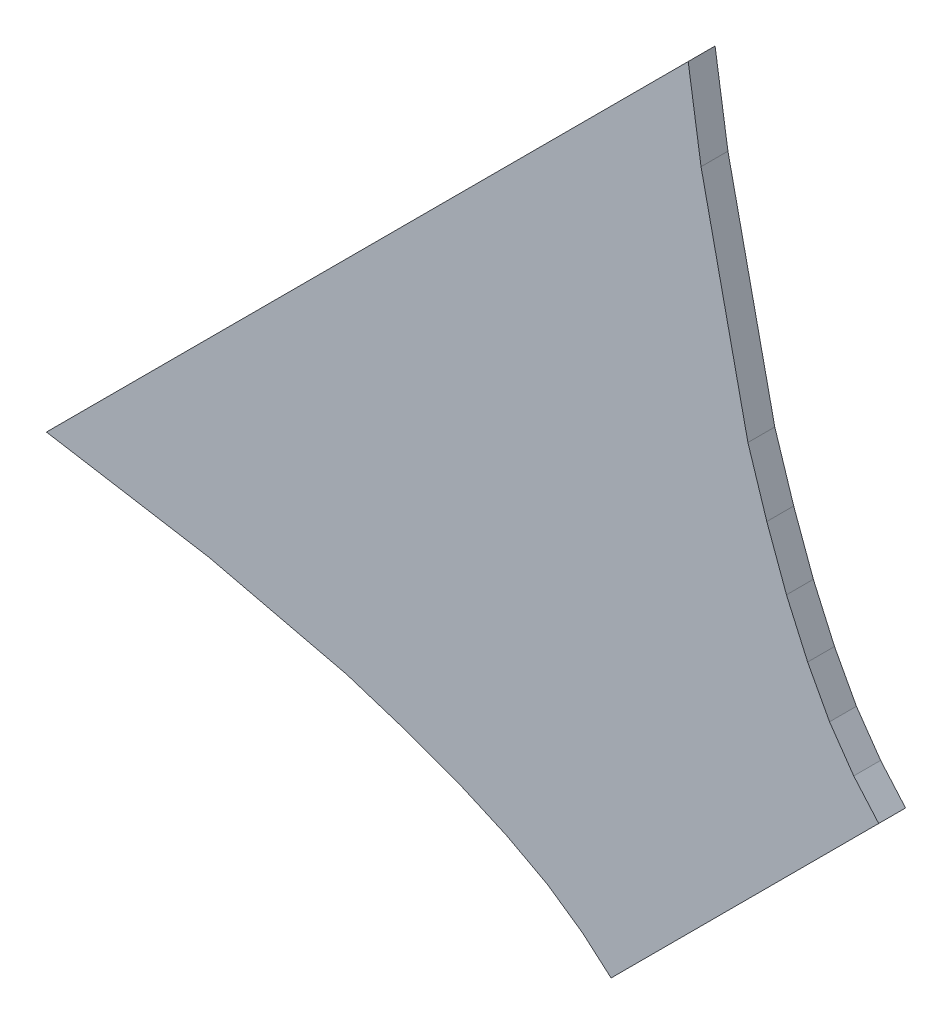
ISO-10303-21;
HEADER;
FILE_DESCRIPTION(('STEP AP214'),'2;1');
FILE_NAME('part.step','',(''),(''),'','','');
FILE_SCHEMA(('AUTOMOTIVE_DESIGN { 1 0 10303 214 1 1 1 1 }'));
ENDSEC;
DATA;
#1=APPLICATION_CONTEXT('core data for automotive mechanical design processes');
#2=APPLICATION_PROTOCOL_DEFINITION('international standard','automotive_design',2000,#1);
#3=PRODUCT_CONTEXT('',#1,'mechanical');
#4=PRODUCT('Part','Part','',(#3));
#5=PRODUCT_RELATED_PRODUCT_CATEGORY('part','',(#4));
#6=PRODUCT_DEFINITION_FORMATION('','',#4);
#7=PRODUCT_DEFINITION_CONTEXT('part definition',#1,'design');
#8=PRODUCT_DEFINITION('design','',#6,#7);
#9=PRODUCT_DEFINITION_SHAPE('','',#8);
#10=(LENGTH_UNIT() NAMED_UNIT(*) SI_UNIT(.MILLI.,.METRE.));
#11=(NAMED_UNIT(*) PLANE_ANGLE_UNIT() SI_UNIT($,.RADIAN.));
#12=(NAMED_UNIT(*) SI_UNIT($,.STERADIAN.) SOLID_ANGLE_UNIT());
#13=UNCERTAINTY_MEASURE_WITH_UNIT(LENGTH_MEASURE(1.E-05),#10,'distance_accuracy_value','');
#14=(GEOMETRIC_REPRESENTATION_CONTEXT(3) GLOBAL_UNCERTAINTY_ASSIGNED_CONTEXT((#13)) GLOBAL_UNIT_ASSIGNED_CONTEXT((#10,
#11,#12)) REPRESENTATION_CONTEXT('',''));
#15=CARTESIAN_POINT('',(0.,0.,0.));
#16=DIRECTION('',(0.,0.,1.));
#17=DIRECTION('',(1.,0.,0.));
#18=AXIS2_PLACEMENT_3D('',#15,#16,#17);
#19=CARTESIAN_POINT('',(92.286003112793,96.0670013427734,0.));
#20=DIRECTION('',(-0.75500349643707,-0.655720764020631,0.));
#21=DIRECTION('',(-0.655720764020631,0.75500349643707,0.));
#22=AXIS2_PLACEMENT_3D('',#19,#20,#21);
#23=PLANE('',#22);
#24=DIRECTION('',(-0.655720764020631,0.75500349643707,0.));
#25=VECTOR('',#24,1.);
#26=CARTESIAN_POINT('',(92.286003112793,96.0670013427734,0.03556));
#27=LINE('',#26,#25);
#28=CARTESIAN_POINT('',(92.286003112793,96.0670013427734,0.03556));
#29=VERTEX_POINT('',#28);
#30=CARTESIAN_POINT('',(92.2529983520508,96.1050033569336,0.03556));
#31=VERTEX_POINT('',#30);
#32=EDGE_CURVE('E11',#29,#31,#27,.T.);
#33=ORIENTED_EDGE('',*,*,#32,.F.);
#34=DIRECTION('',(0.,0.,1.));
#35=VECTOR('',#34,1.);
#36=CARTESIAN_POINT('',(92.286003112793,96.0670013427734,0.));
#37=LINE('',#36,#35);
#38=CARTESIAN_POINT('',(92.286003112793,96.0670013427734,0.));
#39=VERTEX_POINT('',#38);
#40=EDGE_CURVE('E24',#39,#29,#37,.T.);
#41=ORIENTED_EDGE('',*,*,#40,.F.);
#42=DIRECTION('',(-0.655720764020631,0.75500349643707,0.));
#43=VECTOR('',#42,1.);
#44=CARTESIAN_POINT('',(92.286003112793,96.0670013427734,0.));
#45=LINE('',#44,#43);
#46=CARTESIAN_POINT('',(92.2529983520508,96.1050033569336,0.));
#47=VERTEX_POINT('',#46);
#48=EDGE_CURVE('E160',#39,#47,#45,.T.);
#49=ORIENTED_EDGE('',*,*,#48,.T.);
#50=DIRECTION('',(0.,0.,1.));
#51=VECTOR('',#50,1.);
#52=CARTESIAN_POINT('',(92.2529983520508,96.1050033569336,0.));
#53=LINE('',#52,#51);
#54=EDGE_CURVE('E37',#47,#31,#53,.T.);
#55=ORIENTED_EDGE('',*,*,#54,.T.);
#56=EDGE_LOOP('',(#33,#41,#49,#55));
#57=FACE_BOUND('',#56,.T.);
#58=ADVANCED_FACE('F17',(#57),#23,.F.);
#59=CARTESIAN_POINT('',(92.2529983520508,96.1050033569336,0.));
#60=DIRECTION('',(-0.820910752232331,-0.571056509348548,0.));
#61=DIRECTION('',(-0.571056509348548,0.820910752232331,0.));
#62=AXIS2_PLACEMENT_3D('',#59,#60,#61);
#63=PLANE('',#62);
#64=DIRECTION('',(-0.571056509348548,0.820910752232331,0.));
#65=VECTOR('',#64,1.);
#66=CARTESIAN_POINT('',(92.2529983520508,96.1050033569336,0.03556));
#67=LINE('',#66,#65);
#68=CARTESIAN_POINT('',(92.2210006713867,96.1510009765625,0.03556));
#69=VERTEX_POINT('',#68);
#70=EDGE_CURVE('E280',#31,#69,#67,.T.);
#71=ORIENTED_EDGE('',*,*,#70,.F.);
#72=ORIENTED_EDGE('',*,*,#54,.F.);
#73=DIRECTION('',(-0.571056509348548,0.820910752232331,0.));
#74=VECTOR('',#73,1.);
#75=CARTESIAN_POINT('',(92.2529983520508,96.1050033569336,0.));
#76=LINE('',#75,#74);
#77=CARTESIAN_POINT('',(92.2210006713867,96.1510009765625,0.));
#78=VERTEX_POINT('',#77);
#79=EDGE_CURVE('E277',#47,#78,#76,.T.);
#80=ORIENTED_EDGE('',*,*,#79,.T.);
#81=DIRECTION('',(0.,0.,1.));
#82=VECTOR('',#81,1.);
#83=CARTESIAN_POINT('',(92.2210006713867,96.1510009765625,0.));
#84=LINE('',#83,#82);
#85=EDGE_CURVE('E275',#78,#69,#84,.T.);
#86=ORIENTED_EDGE('',*,*,#85,.T.);
#87=EDGE_LOOP('',(#71,#72,#80,#86));
#88=FACE_BOUND('',#87,.T.);
#89=ADVANCED_FACE('F288',(#88),#63,.F.);
#90=CARTESIAN_POINT('',(92.2210006713867,96.1510009765625,0.));
#91=DIRECTION('',(-0.881002115409217,-0.473112325610403,0.));
#92=DIRECTION('',(-0.473112325610403,0.881002115409217,0.));
#93=AXIS2_PLACEMENT_3D('',#90,#91,#92);
#94=PLANE('',#93);
#95=DIRECTION('',(-0.473112325610403,0.881002115409217,0.));
#96=VECTOR('',#95,1.);
#97=CARTESIAN_POINT('',(92.2210006713867,96.1510009765625,0.03556));
#98=LINE('',#97,#96);
#99=CARTESIAN_POINT('',(92.1920013427734,96.2050018310547,0.03556));
#100=VERTEX_POINT('',#99);
#101=EDGE_CURVE('E272',#69,#100,#98,.T.);
#102=ORIENTED_EDGE('',*,*,#101,.F.);
#103=ORIENTED_EDGE('',*,*,#85,.F.);
#104=DIRECTION('',(-0.473112325610403,0.881002115409217,0.));
#105=VECTOR('',#104,1.);
#106=CARTESIAN_POINT('',(92.2210006713867,96.1510009765625,0.));
#107=LINE('',#106,#105);
#108=CARTESIAN_POINT('',(92.1920013427734,96.2050018310547,0.));
#109=VERTEX_POINT('',#108);
#110=EDGE_CURVE('E269',#78,#109,#107,.T.);
#111=ORIENTED_EDGE('',*,*,#110,.T.);
#112=DIRECTION('',(0.,0.,1.));
#113=VECTOR('',#112,1.);
#114=CARTESIAN_POINT('',(92.1920013427734,96.2050018310547,0.));
#115=LINE('',#114,#113);
#116=EDGE_CURVE('E267',#109,#100,#115,.T.);
#117=ORIENTED_EDGE('',*,*,#116,.T.);
#118=EDGE_LOOP('',(#102,#103,#111,#117));
#119=FACE_BOUND('',#118,.T.);
#120=ADVANCED_FACE('F294',(#119),#94,.F.);
#121=CARTESIAN_POINT('',(92.1920013427734,96.2050018310547,0.));
#122=DIRECTION('',(-0.913802420964502,-0.406159002657106,0.));
#123=DIRECTION('',(-0.406159002657106,0.913802420964502,0.));
#124=AXIS2_PLACEMENT_3D('',#121,#122,#123);
#125=PLANE('',#124);
#126=DIRECTION('',(-0.406159002657106,0.913802420964502,0.));
#127=VECTOR('',#126,1.);
#128=CARTESIAN_POINT('',(92.1920013427734,96.2050018310547,0.03556));
#129=LINE('',#128,#127);
#130=CARTESIAN_POINT('',(92.1640014648438,96.2679977416992,0.03556));
#131=VERTEX_POINT('',#130);
#132=EDGE_CURVE('E264',#100,#131,#129,.T.);
#133=ORIENTED_EDGE('',*,*,#132,.F.);
#134=ORIENTED_EDGE('',*,*,#116,.F.);
#135=DIRECTION('',(-0.406159002657106,0.913802420964502,0.));
#136=VECTOR('',#135,1.);
#137=CARTESIAN_POINT('',(92.1920013427734,96.2050018310547,0.));
#138=LINE('',#137,#136);
#139=CARTESIAN_POINT('',(92.1640014648438,96.2679977416992,0.));
#140=VERTEX_POINT('',#139);
#141=EDGE_CURVE('E261',#109,#140,#138,.T.);
#142=ORIENTED_EDGE('',*,*,#141,.T.);
#143=DIRECTION('',(0.,0.,1.));
#144=VECTOR('',#143,1.);
#145=CARTESIAN_POINT('',(92.1640014648438,96.2679977416992,0.));
#146=LINE('',#145,#144);
#147=EDGE_CURVE('E259',#140,#131,#146,.T.);
#148=ORIENTED_EDGE('',*,*,#147,.T.);
#149=EDGE_LOOP('',(#133,#134,#142,#148));
#150=FACE_BOUND('',#149,.T.);
#151=ADVANCED_FACE('F296',(#150),#125,.F.);
#152=CARTESIAN_POINT('',(92.1640014648438,96.2679977416992,0.));
#153=DIRECTION('',(-0.939013218091138,-0.343881049565291,0.));
#154=DIRECTION('',(-0.343881049565291,0.939013218091138,0.));
#155=AXIS2_PLACEMENT_3D('',#152,#153,#154);
#156=PLANE('',#155);
#157=DIRECTION('',(-0.343881049565291,0.939013218091137,0.));
#158=VECTOR('',#157,1.);
#159=CARTESIAN_POINT('',(92.1640014648438,96.2679977416992,0.03556));
#160=LINE('',#159,#158);
#161=CARTESIAN_POINT('',(92.1380004882812,96.338996887207,0.03556));
#162=VERTEX_POINT('',#161);
#163=EDGE_CURVE('E256',#131,#162,#160,.T.);
#164=ORIENTED_EDGE('',*,*,#163,.F.);
#165=ORIENTED_EDGE('',*,*,#147,.F.);
#166=DIRECTION('',(-0.343881049565291,0.939013218091137,0.));
#167=VECTOR('',#166,1.);
#168=CARTESIAN_POINT('',(92.1640014648438,96.2679977416992,0.));
#169=LINE('',#168,#167);
#170=CARTESIAN_POINT('',(92.1380004882812,96.338996887207,0.));
#171=VERTEX_POINT('',#170);
#172=EDGE_CURVE('E253',#140,#171,#169,.T.);
#173=ORIENTED_EDGE('',*,*,#172,.T.);
#174=DIRECTION('',(0.,0.,1.));
#175=VECTOR('',#174,1.);
#176=CARTESIAN_POINT('',(92.1380004882812,96.338996887207,0.));
#177=LINE('',#176,#175);
#178=EDGE_CURVE('E251',#171,#162,#177,.T.);
#179=ORIENTED_EDGE('',*,*,#178,.T.);
#180=EDGE_LOOP('',(#164,#165,#173,#179));
#181=FACE_BOUND('',#180,.T.);
#182=ADVANCED_FACE('F301',(#181),#156,.F.);
#183=CARTESIAN_POINT('',(92.1380004882812,96.338996887207,0.));
#184=DIRECTION('',(-0.952280205556479,-0.305225179343562,0.));
#185=DIRECTION('',(-0.305225179343562,0.952280205556479,0.));
#186=AXIS2_PLACEMENT_3D('',#183,#184,#185);
#187=PLANE('',#186);
#188=DIRECTION('',(-0.305225179343562,0.952280205556479,0.));
#189=VECTOR('',#188,1.);
#190=CARTESIAN_POINT('',(92.1380004882812,96.338996887207,0.03556));
#191=LINE('',#190,#189);
#192=CARTESIAN_POINT('',(92.1129989624023,96.4169998168945,0.03556));
#193=VERTEX_POINT('',#192);
#194=EDGE_CURVE('E248',#162,#193,#191,.T.);
#195=ORIENTED_EDGE('',*,*,#194,.F.);
#196=ORIENTED_EDGE('',*,*,#178,.F.);
#197=DIRECTION('',(-0.305225179343562,0.952280205556479,0.));
#198=VECTOR('',#197,1.);
#199=CARTESIAN_POINT('',(92.1380004882812,96.338996887207,0.));
#200=LINE('',#199,#198);
#201=CARTESIAN_POINT('',(92.1129989624023,96.4169998168945,0.));
#202=VERTEX_POINT('',#201);
#203=EDGE_CURVE('E245',#171,#202,#200,.T.);
#204=ORIENTED_EDGE('',*,*,#203,.T.);
#205=DIRECTION('',(0.,0.,1.));
#206=VECTOR('',#205,1.);
#207=CARTESIAN_POINT('',(92.1129989624023,96.4169998168945,0.));
#208=LINE('',#207,#206);
#209=EDGE_CURVE('E243',#202,#193,#208,.T.);
#210=ORIENTED_EDGE('',*,*,#209,.T.);
#211=EDGE_LOOP('',(#195,#196,#204,#210));
#212=FACE_BOUND('',#211,.T.);
#213=ADVANCED_FACE('F304',(#212),#187,.F.);
#214=CARTESIAN_POINT('',(92.1129989624023,96.4169998168945,0.));
#215=DIRECTION('',(-0.977148498000641,-0.212557787095867,0.));
#216=DIRECTION('',(-0.212557787095867,0.977148498000641,0.));
#217=AXIS2_PLACEMENT_3D('',#214,#215,#216);
#218=PLANE('',#217);
#219=DIRECTION('',(-0.212557787095867,0.977148498000641,0.));
#220=VECTOR('',#219,1.);
#221=CARTESIAN_POINT('',(92.1129989624023,96.4169998168945,0.03556));
#222=LINE('',#221,#220);
#223=CARTESIAN_POINT('',(92.0510025024414,96.7020034790039,0.03556));
#224=VERTEX_POINT('',#223);
#225=EDGE_CURVE('E240',#193,#224,#222,.T.);
#226=ORIENTED_EDGE('',*,*,#225,.F.);
#227=ORIENTED_EDGE('',*,*,#209,.F.);
#228=DIRECTION('',(-0.212557787095867,0.977148498000641,0.));
#229=VECTOR('',#228,1.);
#230=CARTESIAN_POINT('',(92.1129989624023,96.4169998168945,0.));
#231=LINE('',#230,#229);
#232=CARTESIAN_POINT('',(92.0510025024414,96.7020034790039,0.));
#233=VERTEX_POINT('',#232);
#234=EDGE_CURVE('E237',#202,#233,#231,.T.);
#235=ORIENTED_EDGE('',*,*,#234,.T.);
#236=DIRECTION('',(0.,0.,1.));
#237=VECTOR('',#236,1.);
#238=CARTESIAN_POINT('',(92.0510025024414,96.7020034790039,0.));
#239=LINE('',#238,#237);
#240=EDGE_CURVE('E235',#233,#224,#239,.T.);
#241=ORIENTED_EDGE('',*,*,#240,.T.);
#242=EDGE_LOOP('',(#226,#227,#235,#241));
#243=FACE_BOUND('',#242,.T.);
#244=ADVANCED_FACE('F309',(#243),#218,.F.);
#245=CARTESIAN_POINT('',(92.0510025024414,96.7020034790039,0.));
#246=DIRECTION('',(-0.988667996670365,-0.150118594317319,0.));
#247=DIRECTION('',(-0.150118594317319,0.988667996670365,0.));
#248=AXIS2_PLACEMENT_3D('',#245,#246,#247);
#249=PLANE('',#248);
#250=DIRECTION('',(-0.150118594317319,0.988667996670365,0.));
#251=VECTOR('',#250,1.);
#252=CARTESIAN_POINT('',(92.0510025024414,96.7020034790039,0.03556));
#253=LINE('',#252,#251);
#254=CARTESIAN_POINT('',(92.0339965820313,96.8140029907227,0.03556));
#255=VERTEX_POINT('',#254);
#256=EDGE_CURVE('E232',#224,#255,#253,.T.);
#257=ORIENTED_EDGE('',*,*,#256,.F.);
#258=ORIENTED_EDGE('',*,*,#240,.F.);
#259=DIRECTION('',(-0.150118594317319,0.988667996670365,0.));
#260=VECTOR('',#259,1.);
#261=CARTESIAN_POINT('',(92.0510025024414,96.7020034790039,0.));
#262=LINE('',#261,#260);
#263=CARTESIAN_POINT('',(92.0339965820313,96.8140029907227,0.));
#264=VERTEX_POINT('',#263);
#265=EDGE_CURVE('E229',#233,#264,#262,.T.);
#266=ORIENTED_EDGE('',*,*,#265,.T.);
#267=DIRECTION('',(0.,0.,1.));
#268=VECTOR('',#267,1.);
#269=CARTESIAN_POINT('',(92.0339965820313,96.8140029907227,0.));
#270=LINE('',#269,#268);
#271=EDGE_CURVE('E227',#264,#255,#270,.T.);
#272=ORIENTED_EDGE('',*,*,#271,.T.);
#273=EDGE_LOOP('',(#257,#258,#266,#272));
#274=FACE_BOUND('',#273,.T.);
#275=ADVANCED_FACE('F312',(#274),#249,.F.);
#276=CARTESIAN_POINT('',(92.0339965820313,96.8140029907227,0.));
#277=DIRECTION('',(0.70710995831638,-0.70710360404244,0.));
#278=DIRECTION('',(-0.70710360404244,-0.70710995831638,0.));
#279=AXIS2_PLACEMENT_3D('',#276,#277,#278);
#280=PLANE('',#279);
#281=DIRECTION('',(-0.70710360404244,-0.70710995831638,0.));
#282=VECTOR('',#281,1.);
#283=CARTESIAN_POINT('',(92.0339965820313,96.8140029907227,0.03556));
#284=LINE('',#283,#282);
#285=CARTESIAN_POINT('',(91.1849975585938,95.9649963378906,0.03556));
#286=VERTEX_POINT('',#285);
#287=EDGE_CURVE('E224',#255,#286,#284,.T.);
#288=ORIENTED_EDGE('',*,*,#287,.F.);
#289=ORIENTED_EDGE('',*,*,#271,.F.);
#290=DIRECTION('',(-0.70710360404244,-0.70710995831638,0.));
#291=VECTOR('',#290,1.);
#292=CARTESIAN_POINT('',(92.0339965820313,96.8140029907227,0.));
#293=LINE('',#292,#291);
#294=CARTESIAN_POINT('',(91.1849975585938,95.9649963378906,0.));
#295=VERTEX_POINT('',#294);
#296=EDGE_CURVE('E221',#264,#295,#293,.T.);
#297=ORIENTED_EDGE('',*,*,#296,.T.);
#298=DIRECTION('',(0.,0.,1.));
#299=VECTOR('',#298,1.);
#300=CARTESIAN_POINT('',(91.1849975585938,95.9649963378906,0.));
#301=LINE('',#300,#299);
#302=EDGE_CURVE('E219',#295,#286,#301,.T.);
#303=ORIENTED_EDGE('',*,*,#302,.T.);
#304=EDGE_LOOP('',(#288,#289,#297,#303));
#305=FACE_BOUND('',#304,.T.);
#306=ADVANCED_FACE('F317',(#305),#280,.F.);
#307=CARTESIAN_POINT('',(91.1849975585938,95.9649963378906,0.));
#308=DIRECTION('',(0.165119709307029,0.986273532848957,0.));
#309=DIRECTION('',(0.986273532848957,-0.165119709307029,0.));
#310=AXIS2_PLACEMENT_3D('',#307,#308,#309);
#311=PLANE('',#310);
#312=DIRECTION('',(0.986273532848957,-0.165119709307029,0.));
#313=VECTOR('',#312,1.);
#314=CARTESIAN_POINT('',(91.1849975585938,95.9649963378906,0.03556));
#315=LINE('',#314,#313);
#316=CARTESIAN_POINT('',(91.4000015258789,95.9290008544922,0.03556));
#317=VERTEX_POINT('',#316);
#318=EDGE_CURVE('E216',#286,#317,#315,.T.);
#319=ORIENTED_EDGE('',*,*,#318,.F.);
#320=ORIENTED_EDGE('',*,*,#302,.F.);
#321=DIRECTION('',(0.986273532848957,-0.165119709307029,0.));
#322=VECTOR('',#321,1.);
#323=CARTESIAN_POINT('',(91.1849975585938,95.9649963378906,0.));
#324=LINE('',#323,#322);
#325=CARTESIAN_POINT('',(91.4000015258789,95.9290008544922,0.));
#326=VERTEX_POINT('',#325);
#327=EDGE_CURVE('E213',#295,#326,#324,.T.);
#328=ORIENTED_EDGE('',*,*,#327,.T.);
#329=DIRECTION('',(0.,0.,1.));
#330=VECTOR('',#329,1.);
#331=CARTESIAN_POINT('',(91.4000015258789,95.9290008544922,0.));
#332=LINE('',#331,#330);
#333=EDGE_CURVE('E211',#326,#317,#332,.T.);
#334=ORIENTED_EDGE('',*,*,#333,.T.);
#335=EDGE_LOOP('',(#319,#320,#328,#334));
#336=FACE_BOUND('',#335,.T.);
#337=ADVANCED_FACE('F320',(#336),#311,.F.);
#338=CARTESIAN_POINT('',(91.4000015258789,95.9290008544922,0.));
#339=DIRECTION('',(0.229930613750599,0.973207024666526,0.));
#340=DIRECTION('',(0.973207024666526,-0.229930613750599,0.));
#341=AXIS2_PLACEMENT_3D('',#338,#339,#340);
#342=PLANE('',#341);
#343=DIRECTION('',(0.973207024666526,-0.229930613750599,0.));
#344=VECTOR('',#343,1.);
#345=CARTESIAN_POINT('',(91.4000015258789,95.9290008544922,0.03556));
#346=LINE('',#345,#344);
#347=CARTESIAN_POINT('',(91.5820007324219,95.8860015869141,0.03556));
#348=VERTEX_POINT('',#347);
#349=EDGE_CURVE('E208',#317,#348,#346,.T.);
#350=ORIENTED_EDGE('',*,*,#349,.F.);
#351=ORIENTED_EDGE('',*,*,#333,.F.);
#352=DIRECTION('',(0.973207024666526,-0.229930613750599,0.));
#353=VECTOR('',#352,1.);
#354=CARTESIAN_POINT('',(91.4000015258789,95.9290008544922,0.));
#355=LINE('',#354,#353);
#356=CARTESIAN_POINT('',(91.5820007324219,95.8860015869141,0.));
#357=VERTEX_POINT('',#356);
#358=EDGE_CURVE('E205',#326,#357,#355,.T.);
#359=ORIENTED_EDGE('',*,*,#358,.T.);
#360=DIRECTION('',(0.,0.,1.));
#361=VECTOR('',#360,1.);
#362=CARTESIAN_POINT('',(91.5820007324219,95.8860015869141,0.));
#363=LINE('',#362,#361);
#364=EDGE_CURVE('E203',#357,#348,#363,.T.);
#365=ORIENTED_EDGE('',*,*,#364,.T.);
#366=EDGE_LOOP('',(#350,#351,#359,#365));
#367=FACE_BOUND('',#366,.T.);
#368=ADVANCED_FACE('F325',(#367),#342,.F.);
#369=CARTESIAN_POINT('',(91.5820007324219,95.8860015869141,0.));
#370=DIRECTION('',(0.305225179343562,0.952280205556479,0.));
#371=DIRECTION('',(0.952280205556479,-0.305225179343562,0.));
#372=AXIS2_PLACEMENT_3D('',#369,#370,#371);
#373=PLANE('',#372);
#374=DIRECTION('',(0.952280205556479,-0.305225179343562,0.));
#375=VECTOR('',#374,1.);
#376=CARTESIAN_POINT('',(91.5820007324219,95.8860015869141,0.03556));
#377=LINE('',#376,#375);
#378=CARTESIAN_POINT('',(91.6600036621094,95.8610000610352,0.03556));
#379=VERTEX_POINT('',#378);
#380=EDGE_CURVE('E200',#348,#379,#377,.T.);
#381=ORIENTED_EDGE('',*,*,#380,.F.);
#382=ORIENTED_EDGE('',*,*,#364,.F.);
#383=DIRECTION('',(0.952280205556479,-0.305225179343562,0.));
#384=VECTOR('',#383,1.);
#385=CARTESIAN_POINT('',(91.5820007324219,95.8860015869141,0.));
#386=LINE('',#385,#384);
#387=CARTESIAN_POINT('',(91.6600036621094,95.8610000610352,0.));
#388=VERTEX_POINT('',#387);
#389=EDGE_CURVE('E197',#357,#388,#386,.T.);
#390=ORIENTED_EDGE('',*,*,#389,.T.);
#391=DIRECTION('',(0.,0.,1.));
#392=VECTOR('',#391,1.);
#393=CARTESIAN_POINT('',(91.6600036621094,95.8610000610352,0.));
#394=LINE('',#393,#392);
#395=EDGE_CURVE('E195',#388,#379,#394,.T.);
#396=ORIENTED_EDGE('',*,*,#395,.T.);
#397=EDGE_LOOP('',(#381,#382,#390,#396));
#398=FACE_BOUND('',#397,.T.);
#399=ADVANCED_FACE('F328',(#398),#373,.F.);
#400=CARTESIAN_POINT('',(91.6600036621094,95.8610000610352,0.));
#401=DIRECTION('',(0.343881049565291,0.939013218091138,0.));
#402=DIRECTION('',(0.939013218091138,-0.343881049565291,0.));
#403=AXIS2_PLACEMENT_3D('',#400,#401,#402);
#404=PLANE('',#403);
#405=DIRECTION('',(0.939013218091137,-0.343881049565291,0.));
#406=VECTOR('',#405,1.);
#407=CARTESIAN_POINT('',(91.6600036621094,95.8610000610352,0.03556));
#408=LINE('',#407,#406);
#409=CARTESIAN_POINT('',(91.7310028076172,95.8349990844727,0.03556));
#410=VERTEX_POINT('',#409);
#411=EDGE_CURVE('E192',#379,#410,#408,.T.);
#412=ORIENTED_EDGE('',*,*,#411,.F.);
#413=ORIENTED_EDGE('',*,*,#395,.F.);
#414=DIRECTION('',(0.939013218091137,-0.343881049565291,0.));
#415=VECTOR('',#414,1.);
#416=CARTESIAN_POINT('',(91.6600036621094,95.8610000610352,0.));
#417=LINE('',#416,#415);
#418=CARTESIAN_POINT('',(91.7310028076172,95.8349990844727,0.));
#419=VERTEX_POINT('',#418);
#420=EDGE_CURVE('E189',#388,#419,#417,.T.);
#421=ORIENTED_EDGE('',*,*,#420,.T.);
#422=DIRECTION('',(0.,0.,1.));
#423=VECTOR('',#422,1.);
#424=CARTESIAN_POINT('',(91.7310028076172,95.8349990844727,0.));
#425=LINE('',#424,#423);
#426=EDGE_CURVE('E187',#419,#410,#425,.T.);
#427=ORIENTED_EDGE('',*,*,#426,.T.);
#428=EDGE_LOOP('',(#412,#413,#421,#427));
#429=FACE_BOUND('',#428,.T.);
#430=ADVANCED_FACE('F333',(#429),#404,.F.);
#431=CARTESIAN_POINT('',(91.7310028076172,95.8349990844727,0.));
#432=DIRECTION('',(0.406159002657106,0.913802420964502,0.));
#433=DIRECTION('',(0.913802420964502,-0.406159002657106,0.));
#434=AXIS2_PLACEMENT_3D('',#431,#432,#433);
#435=PLANE('',#434);
#436=DIRECTION('',(0.913802420964502,-0.406159002657106,0.));
#437=VECTOR('',#436,1.);
#438=CARTESIAN_POINT('',(91.7310028076172,95.8349990844727,0.03556));
#439=LINE('',#438,#437);
#440=CARTESIAN_POINT('',(91.7939987182617,95.806999206543,0.03556));
#441=VERTEX_POINT('',#440);
#442=EDGE_CURVE('E184',#410,#441,#439,.T.);
#443=ORIENTED_EDGE('',*,*,#442,.F.);
#444=ORIENTED_EDGE('',*,*,#426,.F.);
#445=DIRECTION('',(0.913802420964502,-0.406159002657106,0.));
#446=VECTOR('',#445,1.);
#447=CARTESIAN_POINT('',(91.7310028076172,95.8349990844727,0.));
#448=LINE('',#447,#446);
#449=CARTESIAN_POINT('',(91.7939987182617,95.806999206543,0.));
#450=VERTEX_POINT('',#449);
#451=EDGE_CURVE('E181',#419,#450,#448,.T.);
#452=ORIENTED_EDGE('',*,*,#451,.T.);
#453=DIRECTION('',(0.,0.,1.));
#454=VECTOR('',#453,1.);
#455=CARTESIAN_POINT('',(91.7939987182617,95.806999206543,0.));
#456=LINE('',#455,#454);
#457=EDGE_CURVE('E179',#450,#441,#456,.T.);
#458=ORIENTED_EDGE('',*,*,#457,.T.);
#459=EDGE_LOOP('',(#443,#444,#452,#458));
#460=FACE_BOUND('',#459,.T.);
#461=ADVANCED_FACE('F336',(#460),#435,.F.);
#462=CARTESIAN_POINT('',(91.7939987182617,95.806999206543,0.));
#463=DIRECTION('',(0.473112325610403,0.881002115409217,0.));
#464=DIRECTION('',(0.881002115409217,-0.473112325610403,0.));
#465=AXIS2_PLACEMENT_3D('',#462,#463,#464);
#466=PLANE('',#465);
#467=DIRECTION('',(0.881002115409217,-0.473112325610403,0.));
#468=VECTOR('',#467,1.);
#469=CARTESIAN_POINT('',(91.7939987182617,95.806999206543,0.03556));
#470=LINE('',#469,#468);
#471=CARTESIAN_POINT('',(91.8479995727539,95.7779998779297,0.03556));
#472=VERTEX_POINT('',#471);
#473=EDGE_CURVE('E176',#441,#472,#470,.T.);
#474=ORIENTED_EDGE('',*,*,#473,.F.);
#475=ORIENTED_EDGE('',*,*,#457,.F.);
#476=DIRECTION('',(0.881002115409217,-0.473112325610403,0.));
#477=VECTOR('',#476,1.);
#478=CARTESIAN_POINT('',(91.7939987182617,95.806999206543,0.));
#479=LINE('',#478,#477);
#480=CARTESIAN_POINT('',(91.8479995727539,95.7779998779297,0.));
#481=VERTEX_POINT('',#480);
#482=EDGE_CURVE('E173',#450,#481,#479,.T.);
#483=ORIENTED_EDGE('',*,*,#482,.T.);
#484=DIRECTION('',(0.,0.,1.));
#485=VECTOR('',#484,1.);
#486=CARTESIAN_POINT('',(91.8479995727539,95.7779998779297,0.));
#487=LINE('',#486,#485);
#488=EDGE_CURVE('E171',#481,#472,#487,.T.);
#489=ORIENTED_EDGE('',*,*,#488,.T.);
#490=EDGE_LOOP('',(#474,#475,#483,#489));
#491=FACE_BOUND('',#490,.T.);
#492=ADVANCED_FACE('F341',(#491),#466,.F.);
#493=CARTESIAN_POINT('',(91.8479995727539,95.7779998779297,0.));
#494=DIRECTION('',(0.571056509348548,0.820910752232331,0.));
#495=DIRECTION('',(0.820910752232331,-0.571056509348548,0.));
#496=AXIS2_PLACEMENT_3D('',#493,#494,#495);
#497=PLANE('',#496);
#498=DIRECTION('',(0.820910752232331,-0.571056509348548,0.));
#499=VECTOR('',#498,1.);
#500=CARTESIAN_POINT('',(91.8479995727539,95.7779998779297,0.03556));
#501=LINE('',#500,#499);
#502=CARTESIAN_POINT('',(91.8939971923828,95.7460021972656,0.03556));
#503=VERTEX_POINT('',#502);
#504=EDGE_CURVE('E168',#472,#503,#501,.T.);
#505=ORIENTED_EDGE('',*,*,#504,.F.);
#506=ORIENTED_EDGE('',*,*,#488,.F.);
#507=DIRECTION('',(0.820910752232331,-0.571056509348548,0.));
#508=VECTOR('',#507,1.);
#509=CARTESIAN_POINT('',(91.8479995727539,95.7779998779297,0.));
#510=LINE('',#509,#508);
#511=CARTESIAN_POINT('',(91.8939971923828,95.7460021972656,0.));
#512=VERTEX_POINT('',#511);
#513=EDGE_CURVE('E166',#481,#512,#510,.T.);
#514=ORIENTED_EDGE('',*,*,#513,.T.);
#515=DIRECTION('',(0.,0.,1.));
#516=VECTOR('',#515,1.);
#517=CARTESIAN_POINT('',(91.8939971923828,95.7460021972656,0.));
#518=LINE('',#517,#516);
#519=EDGE_CURVE('E151',#512,#503,#518,.T.);
#520=ORIENTED_EDGE('',*,*,#519,.T.);
#521=EDGE_LOOP('',(#505,#506,#514,#520));
#522=FACE_BOUND('',#521,.T.);
#523=ADVANCED_FACE('F343',(#522),#497,.F.);
#524=CARTESIAN_POINT('',(91.8939971923828,95.7460021972656,0.));
#525=DIRECTION('',(0.655720764020631,0.75500349643707,0.));
#526=DIRECTION('',(0.75500349643707,-0.655720764020631,0.));
#527=AXIS2_PLACEMENT_3D('',#524,#525,#526);
#528=PLANE('',#527);
#529=DIRECTION('',(0.75500349643707,-0.655720764020631,0.));
#530=VECTOR('',#529,1.);
#531=CARTESIAN_POINT('',(91.8939971923828,95.7460021972656,0.03556));
#532=LINE('',#531,#530);
#533=CARTESIAN_POINT('',(91.931999206543,95.7129974365234,0.03556));
#534=VERTEX_POINT('',#533);
#535=EDGE_CURVE('E155',#503,#534,#532,.T.);
#536=ORIENTED_EDGE('',*,*,#535,.F.);
#537=ORIENTED_EDGE('',*,*,#519,.F.);
#538=DIRECTION('',(0.75500349643707,-0.655720764020631,0.));
#539=VECTOR('',#538,1.);
#540=CARTESIAN_POINT('',(91.8939971923828,95.7460021972656,0.));
#541=LINE('',#540,#539);
#542=CARTESIAN_POINT('',(91.931999206543,95.7129974365234,0.));
#543=VERTEX_POINT('',#542);
#544=EDGE_CURVE('E147',#512,#543,#541,.T.);
#545=ORIENTED_EDGE('',*,*,#544,.T.);
#546=DIRECTION('',(0.,0.,1.));
#547=VECTOR('',#546,1.);
#548=CARTESIAN_POINT('',(91.931999206543,95.7129974365234,0.));
#549=LINE('',#548,#547);
#550=EDGE_CURVE('E137',#543,#534,#549,.T.);
#551=ORIENTED_EDGE('',*,*,#550,.T.);
#552=EDGE_LOOP('',(#536,#537,#545,#551));
#553=FACE_BOUND('',#552,.T.);
#554=ADVANCED_FACE('F150',(#553),#528,.F.);
#555=CARTESIAN_POINT('',(91.931999206543,95.7129974365234,0.));
#556=DIRECTION('',(-0.707106781186548,0.707106781186548,0.));
#557=DIRECTION('',(0.707106781186548,0.707106781186548,0.));
#558=AXIS2_PLACEMENT_3D('',#555,#556,#557);
#559=PLANE('',#558);
#560=DIRECTION('',(0.707106781186548,0.707106781186548,0.));
#561=VECTOR('',#560,1.);
#562=CARTESIAN_POINT('',(91.931999206543,95.7129974365234,0.03556));
#563=LINE('',#562,#561);
#564=EDGE_CURVE('E143',#534,#29,#563,.T.);
#565=ORIENTED_EDGE('',*,*,#564,.F.);
#566=ORIENTED_EDGE('',*,*,#550,.F.);
#567=DIRECTION('',(0.707106781186548,0.707106781186548,0.));
#568=VECTOR('',#567,1.);
#569=CARTESIAN_POINT('',(91.931999206543,95.7129974365234,0.));
#570=LINE('',#569,#568);
#571=EDGE_CURVE('E141',#543,#39,#570,.T.);
#572=ORIENTED_EDGE('',*,*,#571,.T.);
#573=ORIENTED_EDGE('',*,*,#40,.T.);
#574=EDGE_LOOP('',(#565,#566,#572,#573));
#575=FACE_BOUND('',#574,.T.);
#576=ADVANCED_FACE('F139',(#575),#559,.F.);
#577=CARTESIAN_POINT('',(92.286003112793,96.0670013427734,0.));
#578=DIRECTION('',(0.,0.,1.));
#579=DIRECTION('',(1.,0.,0.));
#580=AXIS2_PLACEMENT_3D('',#577,#578,#579);
#581=PLANE('',#580);
#582=ORIENTED_EDGE('',*,*,#571,.F.);
#583=ORIENTED_EDGE('',*,*,#544,.F.);
#584=ORIENTED_EDGE('',*,*,#513,.F.);
#585=ORIENTED_EDGE('',*,*,#482,.F.);
#586=ORIENTED_EDGE('',*,*,#451,.F.);
#587=ORIENTED_EDGE('',*,*,#420,.F.);
#588=ORIENTED_EDGE('',*,*,#389,.F.);
#589=ORIENTED_EDGE('',*,*,#358,.F.);
#590=ORIENTED_EDGE('',*,*,#327,.F.);
#591=ORIENTED_EDGE('',*,*,#296,.F.);
#592=ORIENTED_EDGE('',*,*,#265,.F.);
#593=ORIENTED_EDGE('',*,*,#234,.F.);
#594=ORIENTED_EDGE('',*,*,#203,.F.);
#595=ORIENTED_EDGE('',*,*,#172,.F.);
#596=ORIENTED_EDGE('',*,*,#141,.F.);
#597=ORIENTED_EDGE('',*,*,#110,.F.);
#598=ORIENTED_EDGE('',*,*,#79,.F.);
#599=ORIENTED_EDGE('',*,*,#48,.F.);
#600=EDGE_LOOP('',(#582,#583,#584,#585,#586,#587,#588,#589,#590,#591,#592,#593,#594,#595,#596,
#597,#598,#599));
#601=FACE_BOUND('',#600,.T.);
#602=ADVANCED_FACE('F158',(#601),#581,.F.);
#603=CARTESIAN_POINT('',(92.286003112793,96.0670013427734,0.03556));
#604=DIRECTION('',(0.,0.,1.));
#605=DIRECTION('',(1.,0.,0.));
#606=AXIS2_PLACEMENT_3D('',#603,#604,#605);
#607=PLANE('',#606);
#608=ORIENTED_EDGE('',*,*,#32,.T.);
#609=ORIENTED_EDGE('',*,*,#70,.T.);
#610=ORIENTED_EDGE('',*,*,#101,.T.);
#611=ORIENTED_EDGE('',*,*,#132,.T.);
#612=ORIENTED_EDGE('',*,*,#163,.T.);
#613=ORIENTED_EDGE('',*,*,#194,.T.);
#614=ORIENTED_EDGE('',*,*,#225,.T.);
#615=ORIENTED_EDGE('',*,*,#256,.T.);
#616=ORIENTED_EDGE('',*,*,#287,.T.);
#617=ORIENTED_EDGE('',*,*,#318,.T.);
#618=ORIENTED_EDGE('',*,*,#349,.T.);
#619=ORIENTED_EDGE('',*,*,#380,.T.);
#620=ORIENTED_EDGE('',*,*,#411,.T.);
#621=ORIENTED_EDGE('',*,*,#442,.T.);
#622=ORIENTED_EDGE('',*,*,#473,.T.);
#623=ORIENTED_EDGE('',*,*,#504,.T.);
#624=ORIENTED_EDGE('',*,*,#535,.T.);
#625=ORIENTED_EDGE('',*,*,#564,.T.);
#626=EDGE_LOOP('',(#608,#609,#610,#611,#612,#613,#614,#615,#616,#617,#618,#619,#620,#621,#622,
#623,#624,#625));
#627=FACE_BOUND('',#626,.T.);
#628=ADVANCED_FACE('F291',(#627),#607,.T.);
#629=CLOSED_SHELL('',(#58,#89,#120,#151,#182,#213,#244,#275,#306,#337,#368,#399,#430,#461,#492,
#523,#554,#576,#602,#628));
#630=MANIFOLD_SOLID_BREP('B1',#629);
#631=ADVANCED_BREP_SHAPE_REPRESENTATION('',(#18,#630),#14);
#632=SHAPE_DEFINITION_REPRESENTATION(#9,#631);
ENDSEC;
END-ISO-10303-21;
